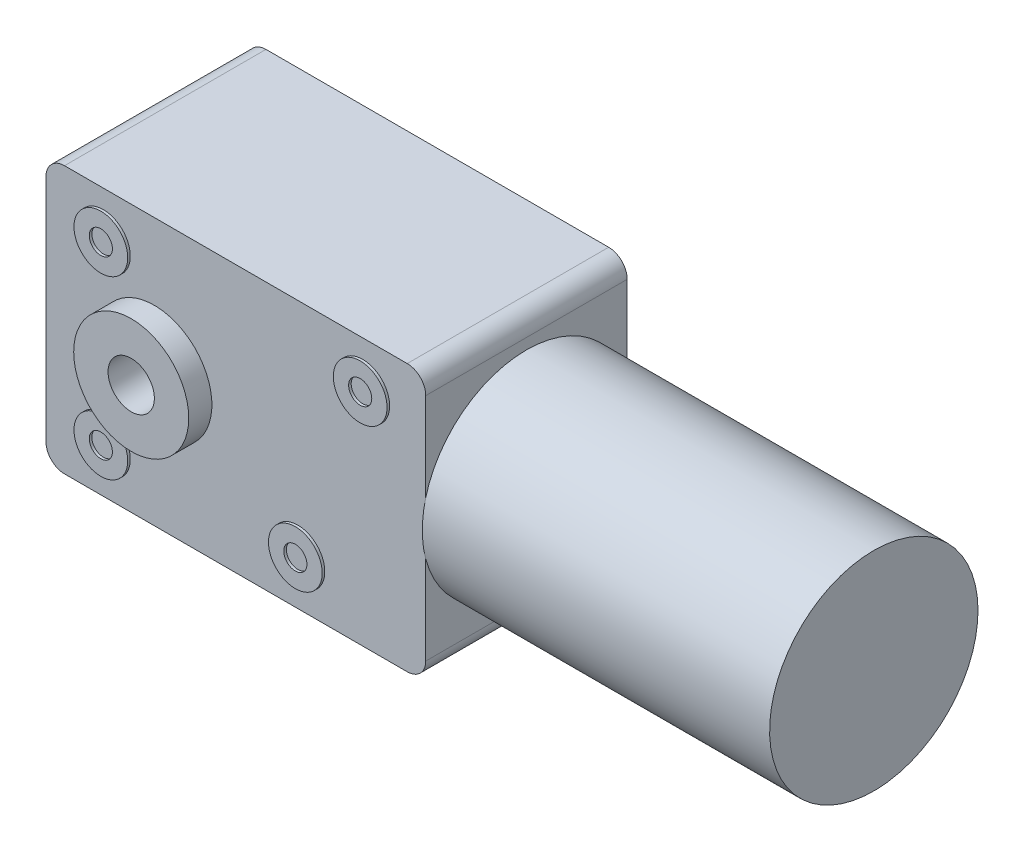
ISO-10303-21;
HEADER;
FILE_DESCRIPTION(('STEP AP214'),'2;1');
FILE_NAME('part.step','',(''),(''),'','','');
FILE_SCHEMA(('AUTOMOTIVE_DESIGN { 1 0 10303 214 1 1 1 1 }'));
ENDSEC;
DATA;
#1=APPLICATION_CONTEXT('core data for automotive mechanical design processes');
#2=APPLICATION_PROTOCOL_DEFINITION('international standard','automotive_design',2000,#1);
#3=PRODUCT_CONTEXT('',#1,'mechanical');
#4=PRODUCT('Part','Part','',(#3));
#5=PRODUCT_RELATED_PRODUCT_CATEGORY('part','',(#4));
#6=PRODUCT_DEFINITION_FORMATION('','',#4);
#7=PRODUCT_DEFINITION_CONTEXT('part definition',#1,'design');
#8=PRODUCT_DEFINITION('design','',#6,#7);
#9=PRODUCT_DEFINITION_SHAPE('','',#8);
#10=(LENGTH_UNIT() NAMED_UNIT(*) SI_UNIT(.MILLI.,.METRE.));
#11=(NAMED_UNIT(*) PLANE_ANGLE_UNIT() SI_UNIT($,.RADIAN.));
#12=(NAMED_UNIT(*) SI_UNIT($,.STERADIAN.) SOLID_ANGLE_UNIT());
#13=UNCERTAINTY_MEASURE_WITH_UNIT(LENGTH_MEASURE(1.E-05),#10,'distance_accuracy_value','');
#14=(GEOMETRIC_REPRESENTATION_CONTEXT(3) GLOBAL_UNCERTAINTY_ASSIGNED_CONTEXT((#13)) GLOBAL_UNIT_ASSIGNED_CONTEXT((#10,
#11,#12)) REPRESENTATION_CONTEXT('',''));
#15=CARTESIAN_POINT('',(0.,0.,0.));
#16=DIRECTION('',(0.,0.,1.));
#17=DIRECTION('',(1.,0.,0.));
#18=AXIS2_PLACEMENT_3D('',#15,#16,#17);
#19=CARTESIAN_POINT('',(41.,24.82,43.5));
#20=DIRECTION('',(-1.,0.,0.));
#21=DIRECTION('',(0.,-1.,0.));
#22=AXIS2_PLACEMENT_3D('',#19,#20,#21);
#23=PLANE('',#22);
#24=CARTESIAN_POINT('',(41.,0.,21.75));
#25=DIRECTION('',(1.,0.,0.));
#26=DIRECTION('',(0.,1.,0.));
#27=AXIS2_PLACEMENT_3D('',#24,#25,#26);
#28=CIRCLE('',#27,22.5);
#29=CARTESIAN_POINT('',(41.,5.76085931090149,0.));
#30=VERTEX_POINT('',#29);
#31=CARTESIAN_POINT('',(41.,5.76085931090149,43.5));
#32=VERTEX_POINT('',#31);
#33=EDGE_CURVE('E138',#30,#32,#28,.T.);
#34=ORIENTED_EDGE('',*,*,#33,.F.);
#35=DIRECTION('',(0.,1.,0.));
#36=VECTOR('',#35,1.);
#37=CARTESIAN_POINT('',(41.,24.82,0.));
#38=LINE('',#37,#36);
#39=CARTESIAN_POINT('',(41.,24.82,0.));
#40=VERTEX_POINT('',#39);
#41=EDGE_CURVE('E125',#30,#40,#38,.T.);
#42=ORIENTED_EDGE('',*,*,#41,.T.);
#43=DIRECTION('',(0.,0.,-1.));
#44=VECTOR('',#43,1.);
#45=CARTESIAN_POINT('',(41.,24.82,43.5));
#46=LINE('',#45,#44);
#47=CARTESIAN_POINT('',(41.,24.82,43.5));
#48=VERTEX_POINT('',#47);
#49=EDGE_CURVE('E245',#48,#40,#46,.T.);
#50=ORIENTED_EDGE('',*,*,#49,.F.);
#51=DIRECTION('',(0.,1.,0.));
#52=VECTOR('',#51,1.);
#53=CARTESIAN_POINT('',(41.,24.82,43.5));
#54=LINE('',#53,#52);
#55=EDGE_CURVE('E61',#32,#48,#54,.T.);
#56=ORIENTED_EDGE('',*,*,#55,.F.);
#57=EDGE_LOOP('',(#34,#42,#50,#56));
#58=FACE_BOUND('',#57,.T.);
#59=ADVANCED_FACE('F45',(#58),#23,.F.);
#60=CARTESIAN_POINT('',(37.,24.82,43.5));
#61=DIRECTION('',(0.,0.,-1.));
#62=DIRECTION('',(-1.,0.,0.));
#63=AXIS2_PLACEMENT_3D('',#60,#61,#62);
#64=CYLINDRICAL_SURFACE('',#63,4.);
#65=CARTESIAN_POINT('',(37.,24.82,0.));
#66=DIRECTION('',(0.,0.,1.));
#67=DIRECTION('',(-1.,0.,0.));
#68=AXIS2_PLACEMENT_3D('',#65,#66,#67);
#69=CIRCLE('',#68,4.);
#70=CARTESIAN_POINT('',(37.,28.82,0.));
#71=VERTEX_POINT('',#70);
#72=EDGE_CURVE('E131',#40,#71,#69,.T.);
#73=ORIENTED_EDGE('',*,*,#72,.T.);
#74=DIRECTION('',(0.,0.,-1.));
#75=VECTOR('',#74,1.);
#76=CARTESIAN_POINT('',(37.,28.82,43.5));
#77=LINE('',#76,#75);
#78=CARTESIAN_POINT('',(37.,28.82,43.5));
#79=VERTEX_POINT('',#78);
#80=EDGE_CURVE('E292',#79,#71,#77,.T.);
#81=ORIENTED_EDGE('',*,*,#80,.F.);
#82=CARTESIAN_POINT('',(37.,24.82,43.5));
#83=DIRECTION('',(0.,0.,1.));
#84=DIRECTION('',(-1.,0.,0.));
#85=AXIS2_PLACEMENT_3D('',#82,#83,#84);
#86=CIRCLE('',#85,4.);
#87=EDGE_CURVE('E220',#48,#79,#86,.T.);
#88=ORIENTED_EDGE('',*,*,#87,.F.);
#89=ORIENTED_EDGE('',*,*,#49,.T.);
#90=EDGE_LOOP('',(#73,#81,#88,#89));
#91=FACE_BOUND('',#90,.T.);
#92=ADVANCED_FACE('F47',(#91),#64,.T.);
#93=CARTESIAN_POINT('',(-37.,28.82,43.5));
#94=DIRECTION('',(0.,-1.,0.));
#95=DIRECTION('',(0.,0.,-1.));
#96=AXIS2_PLACEMENT_3D('',#93,#94,#95);
#97=PLANE('',#96);
#98=DIRECTION('',(-1.,0.,0.));
#99=VECTOR('',#98,1.);
#100=CARTESIAN_POINT('',(-37.,28.82,0.));
#101=LINE('',#100,#99);
#102=CARTESIAN_POINT('',(-37.,28.82,0.));
#103=VERTEX_POINT('',#102);
#104=EDGE_CURVE('E248',#71,#103,#101,.T.);
#105=ORIENTED_EDGE('',*,*,#104,.T.);
#106=DIRECTION('',(0.,0.,-1.));
#107=VECTOR('',#106,1.);
#108=CARTESIAN_POINT('',(-37.,28.82,43.5));
#109=LINE('',#108,#107);
#110=CARTESIAN_POINT('',(-37.,28.82,43.5));
#111=VERTEX_POINT('',#110);
#112=EDGE_CURVE('E288',#111,#103,#109,.T.);
#113=ORIENTED_EDGE('',*,*,#112,.F.);
#114=DIRECTION('',(-1.,0.,0.));
#115=VECTOR('',#114,1.);
#116=CARTESIAN_POINT('',(-37.,28.82,43.5));
#117=LINE('',#116,#115);
#118=EDGE_CURVE('E224',#79,#111,#117,.T.);
#119=ORIENTED_EDGE('',*,*,#118,.F.);
#120=ORIENTED_EDGE('',*,*,#80,.T.);
#121=EDGE_LOOP('',(#105,#113,#119,#120));
#122=FACE_BOUND('',#121,.T.);
#123=ADVANCED_FACE('F332',(#122),#97,.F.);
#124=CARTESIAN_POINT('',(-37.,24.82,43.5));
#125=DIRECTION('',(0.,0.,-1.));
#126=DIRECTION('',(-1.,0.,0.));
#127=AXIS2_PLACEMENT_3D('',#124,#125,#126);
#128=CYLINDRICAL_SURFACE('',#127,4.);
#129=CARTESIAN_POINT('',(-37.,24.82,0.));
#130=DIRECTION('',(0.,0.,1.));
#131=DIRECTION('',(1.,0.,0.));
#132=AXIS2_PLACEMENT_3D('',#129,#130,#131);
#133=CIRCLE('',#132,4.);
#134=CARTESIAN_POINT('',(-41.,24.82,0.));
#135=VERTEX_POINT('',#134);
#136=EDGE_CURVE('E251',#103,#135,#133,.T.);
#137=ORIENTED_EDGE('',*,*,#136,.T.);
#138=DIRECTION('',(0.,0.,-1.));
#139=VECTOR('',#138,1.);
#140=CARTESIAN_POINT('',(-41.,24.82,43.5));
#141=LINE('',#140,#139);
#142=CARTESIAN_POINT('',(-41.,24.82,43.5));
#143=VERTEX_POINT('',#142);
#144=EDGE_CURVE('E284',#143,#135,#141,.T.);
#145=ORIENTED_EDGE('',*,*,#144,.F.);
#146=CARTESIAN_POINT('',(-37.,24.82,43.5));
#147=DIRECTION('',(0.,0.,1.));
#148=DIRECTION('',(1.,0.,0.));
#149=AXIS2_PLACEMENT_3D('',#146,#147,#148);
#150=CIRCLE('',#149,4.);
#151=EDGE_CURVE('E227',#111,#143,#150,.T.);
#152=ORIENTED_EDGE('',*,*,#151,.F.);
#153=ORIENTED_EDGE('',*,*,#112,.T.);
#154=EDGE_LOOP('',(#137,#145,#152,#153));
#155=FACE_BOUND('',#154,.T.);
#156=ADVANCED_FACE('F337',(#155),#128,.T.);
#157=CARTESIAN_POINT('',(-41.,24.82,43.5));
#158=DIRECTION('',(1.,0.,0.));
#159=DIRECTION('',(0.,1.,0.));
#160=AXIS2_PLACEMENT_3D('',#157,#158,#159);
#161=PLANE('',#160);
#162=DIRECTION('',(0.,-1.,0.));
#163=VECTOR('',#162,1.);
#164=CARTESIAN_POINT('',(-41.,24.82,0.));
#165=LINE('',#164,#163);
#166=CARTESIAN_POINT('',(-41.,-24.82,0.));
#167=VERTEX_POINT('',#166);
#168=EDGE_CURVE('E254',#135,#167,#165,.T.);
#169=ORIENTED_EDGE('',*,*,#168,.T.);
#170=DIRECTION('',(0.,0.,-1.));
#171=VECTOR('',#170,1.);
#172=CARTESIAN_POINT('',(-41.,-24.82,43.5));
#173=LINE('',#172,#171);
#174=CARTESIAN_POINT('',(-41.,-24.82,43.5));
#175=VERTEX_POINT('',#174);
#176=EDGE_CURVE('E280',#175,#167,#173,.T.);
#177=ORIENTED_EDGE('',*,*,#176,.F.);
#178=DIRECTION('',(0.,-1.,0.));
#179=VECTOR('',#178,1.);
#180=CARTESIAN_POINT('',(-41.,24.82,43.5));
#181=LINE('',#180,#179);
#182=EDGE_CURVE('E230',#143,#175,#181,.T.);
#183=ORIENTED_EDGE('',*,*,#182,.F.);
#184=ORIENTED_EDGE('',*,*,#144,.T.);
#185=EDGE_LOOP('',(#169,#177,#183,#184));
#186=FACE_BOUND('',#185,.T.);
#187=ADVANCED_FACE('F343',(#186),#161,.F.);
#188=CARTESIAN_POINT('',(-37.,-24.82,43.5));
#189=DIRECTION('',(0.,0.,-1.));
#190=DIRECTION('',(-1.,0.,0.));
#191=AXIS2_PLACEMENT_3D('',#188,#189,#190);
#192=CYLINDRICAL_SURFACE('',#191,4.);
#193=CARTESIAN_POINT('',(-37.,-24.82,0.));
#194=DIRECTION('',(0.,0.,1.));
#195=DIRECTION('',(1.,0.,0.));
#196=AXIS2_PLACEMENT_3D('',#193,#194,#195);
#197=CIRCLE('',#196,4.);
#198=CARTESIAN_POINT('',(-37.,-28.82,0.));
#199=VERTEX_POINT('',#198);
#200=EDGE_CURVE('E257',#167,#199,#197,.T.);
#201=ORIENTED_EDGE('',*,*,#200,.T.);
#202=DIRECTION('',(0.,0.,-1.));
#203=VECTOR('',#202,1.);
#204=CARTESIAN_POINT('',(-37.,-28.82,43.5));
#205=LINE('',#204,#203);
#206=CARTESIAN_POINT('',(-37.,-28.82,43.5));
#207=VERTEX_POINT('',#206);
#208=EDGE_CURVE('E276',#207,#199,#205,.T.);
#209=ORIENTED_EDGE('',*,*,#208,.F.);
#210=CARTESIAN_POINT('',(-37.,-24.82,43.5));
#211=DIRECTION('',(0.,0.,1.));
#212=DIRECTION('',(1.,0.,0.));
#213=AXIS2_PLACEMENT_3D('',#210,#211,#212);
#214=CIRCLE('',#213,4.);
#215=EDGE_CURVE('E233',#175,#207,#214,.T.);
#216=ORIENTED_EDGE('',*,*,#215,.F.);
#217=ORIENTED_EDGE('',*,*,#176,.T.);
#218=EDGE_LOOP('',(#201,#209,#216,#217));
#219=FACE_BOUND('',#218,.T.);
#220=ADVANCED_FACE('F347',(#219),#192,.T.);
#221=CARTESIAN_POINT('',(-37.,-28.82,43.5));
#222=DIRECTION('',(0.,1.,0.));
#223=DIRECTION('',(0.,0.,1.));
#224=AXIS2_PLACEMENT_3D('',#221,#222,#223);
#225=PLANE('',#224);
#226=DIRECTION('',(1.,0.,0.));
#227=VECTOR('',#226,1.);
#228=CARTESIAN_POINT('',(-37.,-28.82,0.));
#229=LINE('',#228,#227);
#230=CARTESIAN_POINT('',(37.,-28.82,0.));
#231=VERTEX_POINT('',#230);
#232=EDGE_CURVE('E260',#199,#231,#229,.T.);
#233=ORIENTED_EDGE('',*,*,#232,.T.);
#234=DIRECTION('',(0.,0.,-1.));
#235=VECTOR('',#234,1.);
#236=CARTESIAN_POINT('',(37.,-28.82,43.5));
#237=LINE('',#236,#235);
#238=CARTESIAN_POINT('',(37.,-28.82,43.5));
#239=VERTEX_POINT('',#238);
#240=EDGE_CURVE('E272',#239,#231,#237,.T.);
#241=ORIENTED_EDGE('',*,*,#240,.F.);
#242=DIRECTION('',(1.,0.,0.));
#243=VECTOR('',#242,1.);
#244=CARTESIAN_POINT('',(-37.,-28.82,43.5));
#245=LINE('',#244,#243);
#246=EDGE_CURVE('E236',#207,#239,#245,.T.);
#247=ORIENTED_EDGE('',*,*,#246,.F.);
#248=ORIENTED_EDGE('',*,*,#208,.T.);
#249=EDGE_LOOP('',(#233,#241,#247,#248));
#250=FACE_BOUND('',#249,.T.);
#251=ADVANCED_FACE('F352',(#250),#225,.F.);
#252=CARTESIAN_POINT('',(37.,-24.82,43.5));
#253=DIRECTION('',(0.,0.,-1.));
#254=DIRECTION('',(-1.,0.,0.));
#255=AXIS2_PLACEMENT_3D('',#252,#253,#254);
#256=CYLINDRICAL_SURFACE('',#255,4.);
#257=CARTESIAN_POINT('',(37.,-24.82,0.));
#258=DIRECTION('',(0.,0.,1.));
#259=DIRECTION('',(1.,0.,0.));
#260=AXIS2_PLACEMENT_3D('',#257,#258,#259);
#261=CIRCLE('',#260,4.);
#262=CARTESIAN_POINT('',(41.,-24.82,0.));
#263=VERTEX_POINT('',#262);
#264=EDGE_CURVE('E134',#231,#263,#261,.T.);
#265=ORIENTED_EDGE('',*,*,#264,.T.);
#266=DIRECTION('',(0.,0.,-1.));
#267=VECTOR('',#266,1.);
#268=CARTESIAN_POINT('',(41.,-24.82,43.5));
#269=LINE('',#268,#267);
#270=CARTESIAN_POINT('',(41.,-24.82,43.5));
#271=VERTEX_POINT('',#270);
#272=EDGE_CURVE('E268',#271,#263,#269,.T.);
#273=ORIENTED_EDGE('',*,*,#272,.F.);
#274=CARTESIAN_POINT('',(37.,-24.82,43.5));
#275=DIRECTION('',(0.,0.,1.));
#276=DIRECTION('',(1.,0.,0.));
#277=AXIS2_PLACEMENT_3D('',#274,#275,#276);
#278=CIRCLE('',#277,4.);
#279=EDGE_CURVE('E239',#239,#271,#278,.T.);
#280=ORIENTED_EDGE('',*,*,#279,.F.);
#281=ORIENTED_EDGE('',*,*,#240,.T.);
#282=EDGE_LOOP('',(#265,#273,#280,#281));
#283=FACE_BOUND('',#282,.T.);
#284=ADVANCED_FACE('F356',(#283),#256,.T.);
#285=CARTESIAN_POINT('',(41.,-5.76085931090144,43.5));
#286=VERTEX_POINT('',#285);
#287=CARTESIAN_POINT('',(41.,-5.76085931090144,0.));
#288=VERTEX_POINT('',#287);
#289=EDGE_CURVE('E69',#286,#288,#28,.T.);
#290=ORIENTED_EDGE('',*,*,#289,.F.);
#291=EDGE_CURVE('E242',#271,#286,#54,.T.);
#292=ORIENTED_EDGE('',*,*,#291,.F.);
#293=ORIENTED_EDGE('',*,*,#272,.T.);
#294=EDGE_CURVE('E136',#263,#288,#38,.T.);
#295=ORIENTED_EDGE('',*,*,#294,.T.);
#296=EDGE_LOOP('',(#290,#292,#293,#295));
#297=FACE_BOUND('',#296,.T.);
#298=ADVANCED_FACE('F316',(#297),#23,.F.);
#299=CARTESIAN_POINT('',(37.,24.82,43.5));
#300=DIRECTION('',(0.,0.,-1.));
#301=DIRECTION('',(-1.,0.,0.));
#302=AXIS2_PLACEMENT_3D('',#299,#300,#301);
#303=PLANE('',#302);
#304=CARTESIAN_POINT('',(-17.6,0.,43.5));
#305=DIRECTION('',(0.,0.,-1.));
#306=DIRECTION('',(-1.,0.,0.));
#307=AXIS2_PLACEMENT_3D('',#304,#305,#306);
#308=CIRCLE('',#307,12.42);
#309=CARTESIAN_POINT('',(-30.02,0.,43.5));
#310=VERTEX_POINT('',#309);
#311=EDGE_CURVE('E11',#310,#310,#308,.F.);
#312=ORIENTED_EDGE('',*,*,#311,.F.);
#313=EDGE_LOOP('',(#312));
#314=FACE_BOUND('',#313,.T.);
#315=CARTESIAN_POINT('',(27.4,19.,43.5));
#316=DIRECTION('',(0.,0.,-1.));
#317=DIRECTION('',(-1.,0.,0.));
#318=AXIS2_PLACEMENT_3D('',#315,#316,#317);
#319=CIRCLE('',#318,5.8);
#320=CARTESIAN_POINT('',(21.6,19.,43.5));
#321=VERTEX_POINT('',#320);
#322=EDGE_CURVE('E54',#321,#321,#319,.F.);
#323=ORIENTED_EDGE('',*,*,#322,.F.);
#324=EDGE_LOOP('',(#323));
#325=FACE_BOUND('',#324,.T.);
#326=CARTESIAN_POINT('',(13.4,-19.,43.5));
#327=DIRECTION('',(0.,0.,-1.));
#328=DIRECTION('',(-1.,0.,0.));
#329=AXIS2_PLACEMENT_3D('',#326,#327,#328);
#330=CIRCLE('',#329,5.8);
#331=CARTESIAN_POINT('',(7.6,-19.,43.5));
#332=VERTEX_POINT('',#331);
#333=EDGE_CURVE('E304',#332,#332,#330,.F.);
#334=ORIENTED_EDGE('',*,*,#333,.F.);
#335=EDGE_LOOP('',(#334));
#336=FACE_BOUND('',#335,.T.);
#337=CARTESIAN_POINT('',(-28.6,-19.,43.5));
#338=DIRECTION('',(0.,0.,-1.));
#339=DIRECTION('',(-1.,0.,0.));
#340=AXIS2_PLACEMENT_3D('',#337,#338,#339);
#341=CIRCLE('',#340,5.8);
#342=CARTESIAN_POINT('',(-34.4,-19.,43.5));
#343=VERTEX_POINT('',#342);
#344=EDGE_CURVE('E300',#343,#343,#341,.F.);
#345=ORIENTED_EDGE('',*,*,#344,.F.);
#346=EDGE_LOOP('',(#345));
#347=FACE_BOUND('',#346,.T.);
#348=CARTESIAN_POINT('',(-28.6,19.,43.5));
#349=DIRECTION('',(0.,0.,-1.));
#350=DIRECTION('',(-1.,0.,0.));
#351=AXIS2_PLACEMENT_3D('',#348,#349,#350);
#352=CIRCLE('',#351,5.8);
#353=CARTESIAN_POINT('',(-34.4,19.,43.5));
#354=VERTEX_POINT('',#353);
#355=EDGE_CURVE('E296',#354,#354,#352,.F.);
#356=ORIENTED_EDGE('',*,*,#355,.F.);
#357=EDGE_LOOP('',(#356));
#358=FACE_BOUND('',#357,.T.);
#359=ORIENTED_EDGE('',*,*,#87,.T.);
#360=ORIENTED_EDGE('',*,*,#118,.T.);
#361=ORIENTED_EDGE('',*,*,#151,.T.);
#362=ORIENTED_EDGE('',*,*,#182,.T.);
#363=ORIENTED_EDGE('',*,*,#215,.T.);
#364=ORIENTED_EDGE('',*,*,#246,.T.);
#365=ORIENTED_EDGE('',*,*,#279,.T.);
#366=ORIENTED_EDGE('',*,*,#291,.T.);
#367=DIRECTION('',(0.,-1.,0.));
#368=VECTOR('',#367,1.);
#369=CARTESIAN_POINT('',(41.,24.82,43.5));
#370=LINE('',#369,#368);
#371=EDGE_CURVE('E160',#32,#286,#370,.T.);
#372=ORIENTED_EDGE('',*,*,#371,.F.);
#373=ORIENTED_EDGE('',*,*,#55,.T.);
#374=EDGE_LOOP('',(#359,#360,#361,#362,#363,#364,#365,#366,#372,#373));
#375=FACE_BOUND('',#374,.T.);
#376=ADVANCED_FACE('F313',(#314,#325,#336,#347,#358,#375),#303,.F.);
#377=CARTESIAN_POINT('',(37.,24.82,0.));
#378=DIRECTION('',(0.,0.,-1.));
#379=DIRECTION('',(-1.,0.,0.));
#380=AXIS2_PLACEMENT_3D('',#377,#378,#379);
#381=PLANE('',#380);
#382=ORIENTED_EDGE('',*,*,#72,.F.);
#383=ORIENTED_EDGE('',*,*,#41,.F.);
#384=EDGE_CURVE('E129',#288,#30,#38,.T.);
#385=ORIENTED_EDGE('',*,*,#384,.F.);
#386=ORIENTED_EDGE('',*,*,#294,.F.);
#387=ORIENTED_EDGE('',*,*,#264,.F.);
#388=ORIENTED_EDGE('',*,*,#232,.F.);
#389=ORIENTED_EDGE('',*,*,#200,.F.);
#390=ORIENTED_EDGE('',*,*,#168,.F.);
#391=ORIENTED_EDGE('',*,*,#136,.F.);
#392=ORIENTED_EDGE('',*,*,#104,.F.);
#393=EDGE_LOOP('',(#382,#383,#385,#386,#387,#388,#389,#390,#391,#392));
#394=FACE_BOUND('',#393,.T.);
#395=ADVANCED_FACE('F126',(#394),#381,.T.);
#396=CARTESIAN_POINT('',(-28.6,19.,44.0574712643678));
#397=DIRECTION('',(0.,0.,-1.));
#398=DIRECTION('',(-1.,0.,0.));
#399=AXIS2_PLACEMENT_3D('',#396,#397,#398);
#400=CYLINDRICAL_SURFACE('',#399,2.5);
#401=CARTESIAN_POINT('',(-28.6,19.,44.0574712643678));
#402=DIRECTION('',(0.,0.,1.));
#403=DIRECTION('',(1.,0.,0.));
#404=AXIS2_PLACEMENT_3D('',#401,#402,#403);
#405=CIRCLE('',#404,2.5);
#406=CARTESIAN_POINT('',(-26.1,19.,44.0574712643678));
#407=VERTEX_POINT('',#406);
#408=EDGE_CURVE('E209',#407,#407,#405,.T.);
#409=ORIENTED_EDGE('',*,*,#408,.T.);
#410=EDGE_LOOP('',(#409));
#411=FACE_BOUND('',#410,.T.);
#412=CARTESIAN_POINT('',(-28.6,19.,43.5));
#413=DIRECTION('',(0.,0.,1.));
#414=DIRECTION('',(1.,0.,0.));
#415=AXIS2_PLACEMENT_3D('',#412,#413,#414);
#416=CIRCLE('',#415,2.5);
#417=CARTESIAN_POINT('',(-26.1,19.,43.5));
#418=VERTEX_POINT('',#417);
#419=EDGE_CURVE('E205',#418,#418,#416,.T.);
#420=ORIENTED_EDGE('',*,*,#419,.F.);
#421=EDGE_LOOP('',(#420));
#422=FACE_BOUND('',#421,.T.);
#423=ADVANCED_FACE('F397',(#411,#422),#400,.F.);
#424=CARTESIAN_POINT('',(-28.6,19.,44.0574712643678));
#425=DIRECTION('',(0.,0.,-1.));
#426=DIRECTION('',(-1.,0.,0.));
#427=AXIS2_PLACEMENT_3D('',#424,#425,#426);
#428=CYLINDRICAL_SURFACE('',#427,5.8);
#429=CARTESIAN_POINT('',(-28.6,19.,44.0574712643678));
#430=DIRECTION('',(0.,0.,1.));
#431=DIRECTION('',(1.,0.,0.));
#432=AXIS2_PLACEMENT_3D('',#429,#430,#431);
#433=CIRCLE('',#432,5.8);
#434=CARTESIAN_POINT('',(-22.8,19.,44.0574712643678));
#435=VERTEX_POINT('',#434);
#436=EDGE_CURVE('E213',#435,#435,#433,.T.);
#437=ORIENTED_EDGE('',*,*,#436,.F.);
#438=EDGE_LOOP('',(#437));
#439=FACE_BOUND('',#438,.T.);
#440=ORIENTED_EDGE('',*,*,#355,.T.);
#441=EDGE_LOOP('',(#440));
#442=FACE_BOUND('',#441,.T.);
#443=ADVANCED_FACE('F402',(#439,#442),#428,.T.);
#444=CARTESIAN_POINT('',(0.,0.,44.0574712643678));
#445=DIRECTION('',(0.,0.,1.));
#446=DIRECTION('',(1.,0.,0.));
#447=AXIS2_PLACEMENT_3D('',#444,#445,#446);
#448=PLANE('',#447);
#449=ORIENTED_EDGE('',*,*,#408,.F.);
#450=EDGE_LOOP('',(#449));
#451=FACE_BOUND('',#450,.T.);
#452=ORIENTED_EDGE('',*,*,#436,.T.);
#453=EDGE_LOOP('',(#452));
#454=FACE_BOUND('',#453,.T.);
#455=ADVANCED_FACE('F415',(#451,#454),#448,.T.);
#456=ORIENTED_EDGE('',*,*,#419,.T.);
#457=EDGE_LOOP('',(#456));
#458=FACE_BOUND('',#457,.T.);
#459=ADVANCED_FACE('F320',(#458),#303,.F.);
#460=CARTESIAN_POINT('',(-28.6,-19.,44.0574712643678));
#461=DIRECTION('',(0.,0.,-1.));
#462=DIRECTION('',(-1.,0.,0.));
#463=AXIS2_PLACEMENT_3D('',#460,#461,#462);
#464=CYLINDRICAL_SURFACE('',#463,2.5);
#465=CARTESIAN_POINT('',(-28.6,-19.,44.0574712643678));
#466=DIRECTION('',(0.,0.,1.));
#467=DIRECTION('',(1.,0.,0.));
#468=AXIS2_PLACEMENT_3D('',#465,#466,#467);
#469=CIRCLE('',#468,2.5);
#470=CARTESIAN_POINT('',(-26.1,-19.,44.0574712643678));
#471=VERTEX_POINT('',#470);
#472=EDGE_CURVE('E197',#471,#471,#469,.T.);
#473=ORIENTED_EDGE('',*,*,#472,.T.);
#474=EDGE_LOOP('',(#473));
#475=FACE_BOUND('',#474,.T.);
#476=CARTESIAN_POINT('',(-28.6,-19.,43.5));
#477=DIRECTION('',(0.,0.,1.));
#478=DIRECTION('',(1.,0.,0.));
#479=AXIS2_PLACEMENT_3D('',#476,#477,#478);
#480=CIRCLE('',#479,2.5);
#481=CARTESIAN_POINT('',(-26.1,-19.,43.5));
#482=VERTEX_POINT('',#481);
#483=EDGE_CURVE('E193',#482,#482,#480,.T.);
#484=ORIENTED_EDGE('',*,*,#483,.F.);
#485=EDGE_LOOP('',(#484));
#486=FACE_BOUND('',#485,.T.);
#487=ADVANCED_FACE('F437',(#475,#486),#464,.F.);
#488=CARTESIAN_POINT('',(-28.6,-19.,44.0574712643678));
#489=DIRECTION('',(0.,0.,-1.));
#490=DIRECTION('',(-1.,0.,0.));
#491=AXIS2_PLACEMENT_3D('',#488,#489,#490);
#492=CYLINDRICAL_SURFACE('',#491,5.8);
#493=CARTESIAN_POINT('',(-28.6,-19.,44.0574712643678));
#494=DIRECTION('',(0.,0.,1.));
#495=DIRECTION('',(1.,0.,0.));
#496=AXIS2_PLACEMENT_3D('',#493,#494,#495);
#497=CIRCLE('',#496,5.8);
#498=CARTESIAN_POINT('',(-22.8,-19.,44.0574712643678));
#499=VERTEX_POINT('',#498);
#500=EDGE_CURVE('E201',#499,#499,#497,.T.);
#501=ORIENTED_EDGE('',*,*,#500,.F.);
#502=EDGE_LOOP('',(#501));
#503=FACE_BOUND('',#502,.T.);
#504=ORIENTED_EDGE('',*,*,#344,.T.);
#505=EDGE_LOOP('',(#504));
#506=FACE_BOUND('',#505,.T.);
#507=ADVANCED_FACE('F449',(#503,#506),#492,.T.);
#508=CARTESIAN_POINT('',(0.,0.,44.0574712643678));
#509=DIRECTION('',(0.,0.,1.));
#510=DIRECTION('',(1.,0.,0.));
#511=AXIS2_PLACEMENT_3D('',#508,#509,#510);
#512=PLANE('',#511);
#513=ORIENTED_EDGE('',*,*,#472,.F.);
#514=EDGE_LOOP('',(#513));
#515=FACE_BOUND('',#514,.T.);
#516=ORIENTED_EDGE('',*,*,#500,.T.);
#517=EDGE_LOOP('',(#516));
#518=FACE_BOUND('',#517,.T.);
#519=ADVANCED_FACE('F460',(#515,#518),#512,.T.);
#520=ORIENTED_EDGE('',*,*,#483,.T.);
#521=EDGE_LOOP('',(#520));
#522=FACE_BOUND('',#521,.T.);
#523=ADVANCED_FACE('F439',(#522),#303,.F.);
#524=CARTESIAN_POINT('',(13.4,-19.,44.0574712643678));
#525=DIRECTION('',(0.,0.,-1.));
#526=DIRECTION('',(-1.,0.,0.));
#527=AXIS2_PLACEMENT_3D('',#524,#525,#526);
#528=CYLINDRICAL_SURFACE('',#527,2.5);
#529=CARTESIAN_POINT('',(13.4,-19.,44.0574712643678));
#530=DIRECTION('',(0.,0.,1.));
#531=DIRECTION('',(1.,0.,0.));
#532=AXIS2_PLACEMENT_3D('',#529,#530,#531);
#533=CIRCLE('',#532,2.5);
#534=CARTESIAN_POINT('',(15.9,-19.,44.0574712643678));
#535=VERTEX_POINT('',#534);
#536=EDGE_CURVE('E185',#535,#535,#533,.T.);
#537=ORIENTED_EDGE('',*,*,#536,.T.);
#538=EDGE_LOOP('',(#537));
#539=FACE_BOUND('',#538,.T.);
#540=CARTESIAN_POINT('',(13.4,-19.,43.5));
#541=DIRECTION('',(0.,0.,1.));
#542=DIRECTION('',(1.,0.,0.));
#543=AXIS2_PLACEMENT_3D('',#540,#541,#542);
#544=CIRCLE('',#543,2.5);
#545=CARTESIAN_POINT('',(15.9,-19.,43.5));
#546=VERTEX_POINT('',#545);
#547=EDGE_CURVE('E181',#546,#546,#544,.T.);
#548=ORIENTED_EDGE('',*,*,#547,.F.);
#549=EDGE_LOOP('',(#548));
#550=FACE_BOUND('',#549,.T.);
#551=ADVANCED_FACE('F481',(#539,#550),#528,.F.);
#552=CARTESIAN_POINT('',(13.4,-19.,44.0574712643678));
#553=DIRECTION('',(0.,0.,-1.));
#554=DIRECTION('',(-1.,0.,0.));
#555=AXIS2_PLACEMENT_3D('',#552,#553,#554);
#556=CYLINDRICAL_SURFACE('',#555,5.8);
#557=CARTESIAN_POINT('',(13.4,-19.,44.0574712643678));
#558=DIRECTION('',(0.,0.,1.));
#559=DIRECTION('',(1.,0.,0.));
#560=AXIS2_PLACEMENT_3D('',#557,#558,#559);
#561=CIRCLE('',#560,5.8);
#562=CARTESIAN_POINT('',(19.2,-19.,44.0574712643678));
#563=VERTEX_POINT('',#562);
#564=EDGE_CURVE('E189',#563,#563,#561,.T.);
#565=ORIENTED_EDGE('',*,*,#564,.F.);
#566=EDGE_LOOP('',(#565));
#567=FACE_BOUND('',#566,.T.);
#568=ORIENTED_EDGE('',*,*,#333,.T.);
#569=EDGE_LOOP('',(#568));
#570=FACE_BOUND('',#569,.T.);
#571=ADVANCED_FACE('F492',(#567,#570),#556,.T.);
#572=CARTESIAN_POINT('',(0.,0.,44.0574712643678));
#573=DIRECTION('',(0.,0.,1.));
#574=DIRECTION('',(1.,0.,0.));
#575=AXIS2_PLACEMENT_3D('',#572,#573,#574);
#576=PLANE('',#575);
#577=ORIENTED_EDGE('',*,*,#536,.F.);
#578=EDGE_LOOP('',(#577));
#579=FACE_BOUND('',#578,.T.);
#580=ORIENTED_EDGE('',*,*,#564,.T.);
#581=EDGE_LOOP('',(#580));
#582=FACE_BOUND('',#581,.T.);
#583=ADVANCED_FACE('F503',(#579,#582),#576,.T.);
#584=ORIENTED_EDGE('',*,*,#547,.T.);
#585=EDGE_LOOP('',(#584));
#586=FACE_BOUND('',#585,.T.);
#587=ADVANCED_FACE('F483',(#586),#303,.F.);
#588=CARTESIAN_POINT('',(27.4,19.,44.0574712643678));
#589=DIRECTION('',(0.,0.,-1.));
#590=DIRECTION('',(-1.,0.,0.));
#591=AXIS2_PLACEMENT_3D('',#588,#589,#590);
#592=CYLINDRICAL_SURFACE('',#591,2.5);
#593=CARTESIAN_POINT('',(27.4,19.,44.0574712643678));
#594=DIRECTION('',(0.,0.,1.));
#595=DIRECTION('',(1.,0.,0.));
#596=AXIS2_PLACEMENT_3D('',#593,#594,#595);
#597=CIRCLE('',#596,2.5);
#598=CARTESIAN_POINT('',(29.9,19.,44.0574712643678));
#599=VERTEX_POINT('',#598);
#600=EDGE_CURVE('E173',#599,#599,#597,.T.);
#601=ORIENTED_EDGE('',*,*,#600,.T.);
#602=EDGE_LOOP('',(#601));
#603=FACE_BOUND('',#602,.T.);
#604=CARTESIAN_POINT('',(27.4,19.,43.5));
#605=DIRECTION('',(0.,0.,1.));
#606=DIRECTION('',(1.,0.,0.));
#607=AXIS2_PLACEMENT_3D('',#604,#605,#606);
#608=CIRCLE('',#607,2.5);
#609=CARTESIAN_POINT('',(29.9,19.,43.5));
#610=VERTEX_POINT('',#609);
#611=EDGE_CURVE('E172',#610,#610,#608,.T.);
#612=ORIENTED_EDGE('',*,*,#611,.F.);
#613=EDGE_LOOP('',(#612));
#614=FACE_BOUND('',#613,.T.);
#615=ADVANCED_FACE('F524',(#603,#614),#592,.F.);
#616=CARTESIAN_POINT('',(27.4,19.,44.0574712643678));
#617=DIRECTION('',(0.,0.,-1.));
#618=DIRECTION('',(-1.,0.,0.));
#619=AXIS2_PLACEMENT_3D('',#616,#617,#618);
#620=CYLINDRICAL_SURFACE('',#619,5.8);
#621=CARTESIAN_POINT('',(27.4,19.,44.0574712643678));
#622=DIRECTION('',(0.,0.,1.));
#623=DIRECTION('',(1.,0.,0.));
#624=AXIS2_PLACEMENT_3D('',#621,#622,#623);
#625=CIRCLE('',#624,5.8);
#626=CARTESIAN_POINT('',(33.2,19.,44.0574712643678));
#627=VERTEX_POINT('',#626);
#628=EDGE_CURVE('E177',#627,#627,#625,.T.);
#629=ORIENTED_EDGE('',*,*,#628,.F.);
#630=EDGE_LOOP('',(#629));
#631=FACE_BOUND('',#630,.T.);
#632=ORIENTED_EDGE('',*,*,#322,.T.);
#633=EDGE_LOOP('',(#632));
#634=FACE_BOUND('',#633,.T.);
#635=ADVANCED_FACE('F311',(#631,#634),#620,.T.);
#636=CARTESIAN_POINT('',(0.,0.,44.0574712643678));
#637=DIRECTION('',(0.,0.,1.));
#638=DIRECTION('',(1.,0.,0.));
#639=AXIS2_PLACEMENT_3D('',#636,#637,#638);
#640=PLANE('',#639);
#641=ORIENTED_EDGE('',*,*,#600,.F.);
#642=EDGE_LOOP('',(#641));
#643=FACE_BOUND('',#642,.T.);
#644=ORIENTED_EDGE('',*,*,#628,.T.);
#645=EDGE_LOOP('',(#644));
#646=FACE_BOUND('',#645,.T.);
#647=ADVANCED_FACE('F543',(#643,#646),#640,.T.);
#648=ORIENTED_EDGE('',*,*,#611,.T.);
#649=EDGE_LOOP('',(#648));
#650=FACE_BOUND('',#649,.T.);
#651=ADVANCED_FACE('F319',(#650),#303,.F.);
#652=CARTESIAN_POINT('',(-17.6,0.,48.5));
#653=DIRECTION('',(0.,0.,-1.));
#654=DIRECTION('',(-1.,0.,0.));
#655=AXIS2_PLACEMENT_3D('',#652,#653,#654);
#656=CYLINDRICAL_SURFACE('',#655,5.);
#657=CARTESIAN_POINT('',(-17.6,0.,48.5));
#658=DIRECTION('',(0.,0.,1.));
#659=DIRECTION('',(1.,0.,0.));
#660=AXIS2_PLACEMENT_3D('',#657,#658,#659);
#661=CIRCLE('',#660,5.);
#662=CARTESIAN_POINT('',(-12.6,0.,48.5));
#663=VERTEX_POINT('',#662);
#664=EDGE_CURVE('E164',#663,#663,#661,.T.);
#665=ORIENTED_EDGE('',*,*,#664,.T.);
#666=EDGE_LOOP('',(#665));
#667=FACE_BOUND('',#666,.T.);
#668=CARTESIAN_POINT('',(-17.6,0.,33.5));
#669=DIRECTION('',(0.,0.,1.));
#670=DIRECTION('',(1.,0.,0.));
#671=AXIS2_PLACEMENT_3D('',#668,#669,#670);
#672=CIRCLE('',#671,5.);
#673=CARTESIAN_POINT('',(-12.6,0.,33.5));
#674=VERTEX_POINT('',#673);
#675=EDGE_CURVE('E145',#674,#674,#672,.T.);
#676=ORIENTED_EDGE('',*,*,#675,.F.);
#677=EDGE_LOOP('',(#676));
#678=FACE_BOUND('',#677,.T.);
#679=ADVANCED_FACE('F564',(#667,#678),#656,.F.);
#680=CARTESIAN_POINT('',(-17.6,0.,48.5));
#681=DIRECTION('',(0.,0.,-1.));
#682=DIRECTION('',(-1.,0.,0.));
#683=AXIS2_PLACEMENT_3D('',#680,#681,#682);
#684=CYLINDRICAL_SURFACE('',#683,12.42);
#685=CARTESIAN_POINT('',(-17.6,0.,48.5));
#686=DIRECTION('',(0.,0.,1.));
#687=DIRECTION('',(1.,0.,0.));
#688=AXIS2_PLACEMENT_3D('',#685,#686,#687);
#689=CIRCLE('',#688,12.42);
#690=CARTESIAN_POINT('',(-5.18000000000001,0.,48.5));
#691=VERTEX_POINT('',#690);
#692=EDGE_CURVE('E168',#691,#691,#689,.T.);
#693=ORIENTED_EDGE('',*,*,#692,.F.);
#694=EDGE_LOOP('',(#693));
#695=FACE_BOUND('',#694,.T.);
#696=ORIENTED_EDGE('',*,*,#311,.T.);
#697=EDGE_LOOP('',(#696));
#698=FACE_BOUND('',#697,.T.);
#699=ADVANCED_FACE('F571',(#695,#698),#684,.T.);
#700=CARTESIAN_POINT('',(0.,0.,48.5));
#701=DIRECTION('',(0.,0.,1.));
#702=DIRECTION('',(1.,0.,0.));
#703=AXIS2_PLACEMENT_3D('',#700,#701,#702);
#704=PLANE('',#703);
#705=ORIENTED_EDGE('',*,*,#664,.F.);
#706=EDGE_LOOP('',(#705));
#707=FACE_BOUND('',#706,.T.);
#708=ORIENTED_EDGE('',*,*,#692,.T.);
#709=EDGE_LOOP('',(#708));
#710=FACE_BOUND('',#709,.T.);
#711=ADVANCED_FACE('F576',(#707,#710),#704,.T.);
#712=CARTESIAN_POINT('',(41.,0.,21.75));
#713=DIRECTION('',(1.,0.,0.));
#714=DIRECTION('',(0.,1.,0.));
#715=AXIS2_PLACEMENT_3D('',#712,#713,#714);
#716=PLANE('',#715);
#717=EDGE_CURVE('E147',#32,#286,#28,.T.);
#718=ORIENTED_EDGE('',*,*,#717,.F.);
#719=ORIENTED_EDGE('',*,*,#371,.T.);
#720=EDGE_LOOP('',(#718,#719));
#721=FACE_BOUND('',#720,.T.);
#722=ADVANCED_FACE('F586',(#721),#716,.F.);
#723=CARTESIAN_POINT('',(116.,0.,21.75));
#724=DIRECTION('',(-1.,0.,0.));
#725=DIRECTION('',(0.,-1.,0.));
#726=AXIS2_PLACEMENT_3D('',#723,#724,#725);
#727=CYLINDRICAL_SURFACE('',#726,22.5);
#728=CARTESIAN_POINT('',(116.,0.,21.75));
#729=DIRECTION('',(1.,0.,0.));
#730=DIRECTION('',(0.,1.,0.));
#731=AXIS2_PLACEMENT_3D('',#728,#729,#730);
#732=CIRCLE('',#731,22.5);
#733=CARTESIAN_POINT('',(116.,22.5000000000001,21.75));
#734=VERTEX_POINT('',#733);
#735=EDGE_CURVE('E158',#734,#734,#732,.T.);
#736=ORIENTED_EDGE('',*,*,#735,.F.);
#737=EDGE_LOOP('',(#736));
#738=FACE_BOUND('',#737,.T.);
#739=ORIENTED_EDGE('',*,*,#717,.T.);
#740=ORIENTED_EDGE('',*,*,#289,.T.);
#741=EDGE_CURVE('E144',#288,#30,#28,.T.);
#742=ORIENTED_EDGE('',*,*,#741,.T.);
#743=ORIENTED_EDGE('',*,*,#33,.T.);
#744=EDGE_LOOP('',(#739,#740,#742,#743));
#745=FACE_BOUND('',#744,.T.);
#746=ADVANCED_FACE('F152',(#738,#745),#727,.T.);
#747=CARTESIAN_POINT('',(116.,0.,21.75));
#748=DIRECTION('',(1.,0.,0.));
#749=DIRECTION('',(0.,1.,0.));
#750=AXIS2_PLACEMENT_3D('',#747,#748,#749);
#751=PLANE('',#750);
#752=ORIENTED_EDGE('',*,*,#735,.T.);
#753=EDGE_LOOP('',(#752));
#754=FACE_BOUND('',#753,.T.);
#755=ADVANCED_FACE('F629',(#754),#751,.T.);
#756=ORIENTED_EDGE('',*,*,#384,.T.);
#757=ORIENTED_EDGE('',*,*,#741,.F.);
#758=EDGE_LOOP('',(#756,#757));
#759=FACE_BOUND('',#758,.T.);
#760=ADVANCED_FACE('F150',(#759),#716,.F.);
#761=CARTESIAN_POINT('',(0.,0.,33.5));
#762=DIRECTION('',(0.,0.,1.));
#763=DIRECTION('',(1.,0.,0.));
#764=AXIS2_PLACEMENT_3D('',#761,#762,#763);
#765=PLANE('',#764);
#766=ORIENTED_EDGE('',*,*,#675,.T.);
#767=EDGE_LOOP('',(#766));
#768=FACE_BOUND('',#767,.T.);
#769=ADVANCED_FACE('F650',(#768),#765,.T.);
#770=CLOSED_SHELL('',(#59,#92,#123,#156,#187,#220,#251,#284,#298,#376,#395,#423,#443,#455,#459,
#487,#507,#519,#523,#551,#571,#583,#587,#615,#635,#647,#651,#679,#699,#711,#722,#746,#755,#760,#769));
#771=MANIFOLD_SOLID_BREP('B2',#770);
#772=ADVANCED_BREP_SHAPE_REPRESENTATION('',(#18,#771),#14);
#773=SHAPE_DEFINITION_REPRESENTATION(#9,#772);
ENDSEC;
END-ISO-10303-21;
